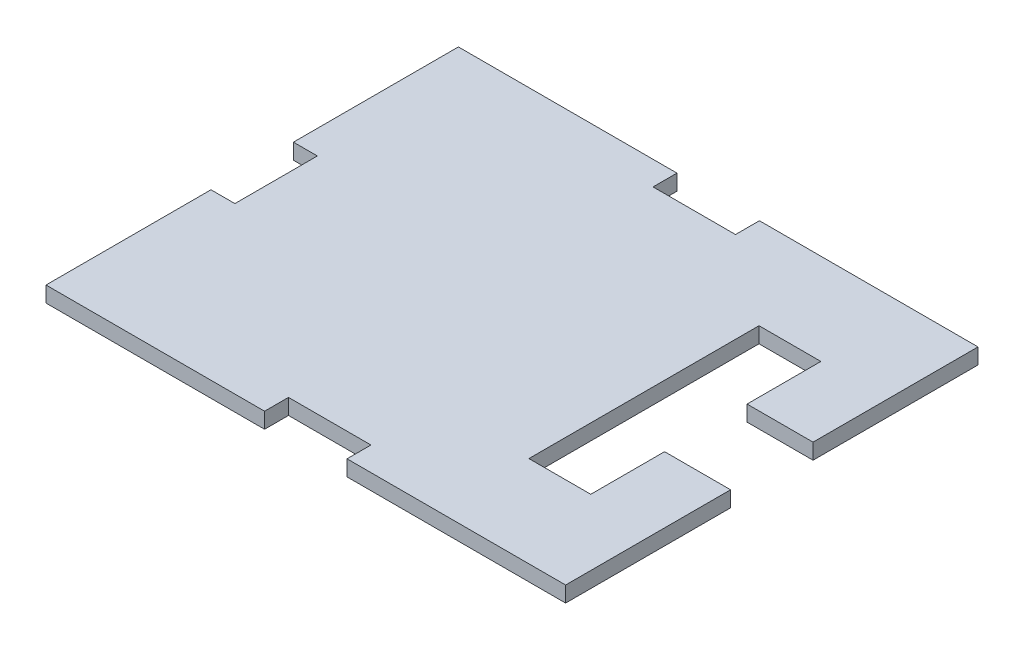
ISO-10303-21;
HEADER;
FILE_DESCRIPTION(('STEP AP214'),'2;1');
FILE_NAME('part.step','',(''),(''),'','','');
FILE_SCHEMA(('AUTOMOTIVE_DESIGN { 1 0 10303 214 1 1 1 1 }'));
ENDSEC;
DATA;
#1=APPLICATION_CONTEXT('core data for automotive mechanical design processes');
#2=APPLICATION_PROTOCOL_DEFINITION('international standard','automotive_design',2000,#1);
#3=PRODUCT_CONTEXT('',#1,'mechanical');
#4=PRODUCT('Part','Part','',(#3));
#5=PRODUCT_RELATED_PRODUCT_CATEGORY('part','',(#4));
#6=PRODUCT_DEFINITION_FORMATION('','',#4);
#7=PRODUCT_DEFINITION_CONTEXT('part definition',#1,'design');
#8=PRODUCT_DEFINITION('design','',#6,#7);
#9=PRODUCT_DEFINITION_SHAPE('','',#8);
#10=(LENGTH_UNIT() NAMED_UNIT(*) SI_UNIT(.MILLI.,.METRE.));
#11=(NAMED_UNIT(*) PLANE_ANGLE_UNIT() SI_UNIT($,.RADIAN.));
#12=(NAMED_UNIT(*) SI_UNIT($,.STERADIAN.) SOLID_ANGLE_UNIT());
#13=UNCERTAINTY_MEASURE_WITH_UNIT(LENGTH_MEASURE(1.E-05),#10,'distance_accuracy_value','');
#14=(GEOMETRIC_REPRESENTATION_CONTEXT(3) GLOBAL_UNCERTAINTY_ASSIGNED_CONTEXT((#13)) GLOBAL_UNIT_ASSIGNED_CONTEXT((#10,
#11,#12)) REPRESENTATION_CONTEXT('',''));
#15=CARTESIAN_POINT('',(0.,0.,0.));
#16=DIRECTION('',(0.,0.,1.));
#17=DIRECTION('',(1.,0.,0.));
#18=AXIS2_PLACEMENT_3D('',#15,#16,#17);
#19=CARTESIAN_POINT('',(80.01,4.826,12.7));
#20=DIRECTION('',(-1.,0.,0.));
#21=DIRECTION('',(0.,0.,1.));
#22=AXIS2_PLACEMENT_3D('',#19,#20,#21);
#23=PLANE('',#22);
#24=DIRECTION('',(0.,0.,-1.));
#25=VECTOR('',#24,1.);
#26=CARTESIAN_POINT('',(80.01,0.,12.7));
#27=LINE('',#26,#25);
#28=CARTESIAN_POINT('',(80.01,0.,63.5));
#29=VERTEX_POINT('',#28);
#30=CARTESIAN_POINT('',(80.01,0.,12.7));
#31=VERTEX_POINT('',#30);
#32=EDGE_CURVE('E204',#29,#31,#27,.T.);
#33=ORIENTED_EDGE('',*,*,#32,.T.);
#34=DIRECTION('',(0.,-1.,0.));
#35=VECTOR('',#34,1.);
#36=CARTESIAN_POINT('',(80.01,4.826,12.7));
#37=LINE('',#36,#35);
#38=CARTESIAN_POINT('',(80.01,4.826,12.7));
#39=VERTEX_POINT('',#38);
#40=EDGE_CURVE('E12',#39,#31,#37,.T.);
#41=ORIENTED_EDGE('',*,*,#40,.F.);
#42=DIRECTION('',(0.,0.,-1.));
#43=VECTOR('',#42,1.);
#44=CARTESIAN_POINT('',(80.01,4.826,12.7));
#45=LINE('',#44,#43);
#46=CARTESIAN_POINT('',(80.01,4.826,63.5));
#47=VERTEX_POINT('',#46);
#48=EDGE_CURVE('E243',#47,#39,#45,.T.);
#49=ORIENTED_EDGE('',*,*,#48,.F.);
#50=DIRECTION('',(0.,-1.,0.));
#51=VECTOR('',#50,1.);
#52=CARTESIAN_POINT('',(80.01,4.826,63.5));
#53=LINE('',#52,#51);
#54=EDGE_CURVE('E200',#47,#29,#53,.T.);
#55=ORIENTED_EDGE('',*,*,#54,.T.);
#56=EDGE_LOOP('',(#33,#41,#49,#55));
#57=FACE_BOUND('',#56,.T.);
#58=ADVANCED_FACE('F34',(#57),#23,.F.);
#59=CARTESIAN_POINT('',(80.01,4.826,12.7));
#60=DIRECTION('',(0.,0.,1.));
#61=DIRECTION('',(1.,0.,0.));
#62=AXIS2_PLACEMENT_3D('',#59,#60,#61);
#63=PLANE('',#62);
#64=DIRECTION('',(-1.,0.,0.));
#65=VECTOR('',#64,1.);
#66=CARTESIAN_POINT('',(80.01,0.,12.7));
#67=LINE('',#66,#65);
#68=CARTESIAN_POINT('',(59.69,0.,12.7));
#69=VERTEX_POINT('',#68);
#70=EDGE_CURVE('E207',#31,#69,#67,.T.);
#71=ORIENTED_EDGE('',*,*,#70,.T.);
#72=DIRECTION('',(0.,1.,0.));
#73=VECTOR('',#72,1.);
#74=CARTESIAN_POINT('',(59.69,0.,12.7));
#75=LINE('',#74,#73);
#76=CARTESIAN_POINT('',(59.69,4.826,12.7));
#77=VERTEX_POINT('',#76);
#78=EDGE_CURVE('E371',#69,#77,#75,.T.);
#79=ORIENTED_EDGE('',*,*,#78,.T.);
#80=DIRECTION('',(-1.,0.,0.));
#81=VECTOR('',#80,1.);
#82=CARTESIAN_POINT('',(80.01,4.826,12.7));
#83=LINE('',#82,#81);
#84=EDGE_CURVE('E128',#39,#77,#83,.T.);
#85=ORIENTED_EDGE('',*,*,#84,.F.);
#86=ORIENTED_EDGE('',*,*,#40,.T.);
#87=EDGE_LOOP('',(#71,#79,#85,#86));
#88=FACE_BOUND('',#87,.T.);
#89=ADVANCED_FACE('F431',(#88),#63,.F.);
#90=CARTESIAN_POINT('',(80.01,4.826,-12.7));
#91=DIRECTION('',(0.,0.,-1.));
#92=DIRECTION('',(-1.,0.,0.));
#93=AXIS2_PLACEMENT_3D('',#90,#91,#92);
#94=PLANE('',#93);
#95=DIRECTION('',(1.,0.,0.));
#96=VECTOR('',#95,1.);
#97=CARTESIAN_POINT('',(80.01,0.,-12.7));
#98=LINE('',#97,#96);
#99=CARTESIAN_POINT('',(59.69,0.,-12.7));
#100=VERTEX_POINT('',#99);
#101=CARTESIAN_POINT('',(80.01,0.,-12.7));
#102=VERTEX_POINT('',#101);
#103=EDGE_CURVE('E211',#100,#102,#98,.T.);
#104=ORIENTED_EDGE('',*,*,#103,.T.);
#105=DIRECTION('',(0.,-1.,0.));
#106=VECTOR('',#105,1.);
#107=CARTESIAN_POINT('',(80.01,4.826,-12.7));
#108=LINE('',#107,#106);
#109=CARTESIAN_POINT('',(80.01,4.826,-12.7));
#110=VERTEX_POINT('',#109);
#111=EDGE_CURVE('E41',#110,#102,#108,.T.);
#112=ORIENTED_EDGE('',*,*,#111,.F.);
#113=DIRECTION('',(1.,0.,0.));
#114=VECTOR('',#113,1.);
#115=CARTESIAN_POINT('',(80.01,4.826,-12.7));
#116=LINE('',#115,#114);
#117=CARTESIAN_POINT('',(59.69,4.826,-12.7));
#118=VERTEX_POINT('',#117);
#119=EDGE_CURVE('E349',#118,#110,#116,.T.);
#120=ORIENTED_EDGE('',*,*,#119,.F.);
#121=DIRECTION('',(0.,1.,0.));
#122=VECTOR('',#121,1.);
#123=CARTESIAN_POINT('',(59.69,0.,-12.7));
#124=LINE('',#123,#122);
#125=EDGE_CURVE('E361',#100,#118,#124,.T.);
#126=ORIENTED_EDGE('',*,*,#125,.F.);
#127=EDGE_LOOP('',(#104,#112,#120,#126));
#128=FACE_BOUND('',#127,.T.);
#129=ADVANCED_FACE('F360',(#128),#94,.F.);
#130=CARTESIAN_POINT('',(80.01,4.826,-63.5));
#131=DIRECTION('',(-1.,0.,0.));
#132=DIRECTION('',(0.,0.,1.));
#133=AXIS2_PLACEMENT_3D('',#130,#131,#132);
#134=PLANE('',#133);
#135=DIRECTION('',(0.,0.,-1.));
#136=VECTOR('',#135,1.);
#137=CARTESIAN_POINT('',(80.01,0.,-63.5));
#138=LINE('',#137,#136);
#139=CARTESIAN_POINT('',(80.01,0.,-63.5));
#140=VERTEX_POINT('',#139);
#141=EDGE_CURVE('E213',#102,#140,#138,.T.);
#142=ORIENTED_EDGE('',*,*,#141,.T.);
#143=DIRECTION('',(0.,-1.,0.));
#144=VECTOR('',#143,1.);
#145=CARTESIAN_POINT('',(80.01,4.826,-63.5));
#146=LINE('',#145,#144);
#147=CARTESIAN_POINT('',(80.01,4.826,-63.5));
#148=VERTEX_POINT('',#147);
#149=EDGE_CURVE('E280',#148,#140,#146,.T.);
#150=ORIENTED_EDGE('',*,*,#149,.F.);
#151=DIRECTION('',(0.,0.,-1.));
#152=VECTOR('',#151,1.);
#153=CARTESIAN_POINT('',(80.01,4.826,-63.5));
#154=LINE('',#153,#152);
#155=EDGE_CURVE('E289',#110,#148,#154,.T.);
#156=ORIENTED_EDGE('',*,*,#155,.F.);
#157=ORIENTED_EDGE('',*,*,#111,.T.);
#158=EDGE_LOOP('',(#142,#150,#156,#157));
#159=FACE_BOUND('',#158,.T.);
#160=ADVANCED_FACE('F287',(#159),#134,.F.);
#161=CARTESIAN_POINT('',(12.7,4.826,-63.5));
#162=DIRECTION('',(0.,0.,1.));
#163=DIRECTION('',(1.,0.,0.));
#164=AXIS2_PLACEMENT_3D('',#161,#162,#163);
#165=PLANE('',#164);
#166=DIRECTION('',(-1.,0.,0.));
#167=VECTOR('',#166,1.);
#168=CARTESIAN_POINT('',(12.7,0.,-63.5));
#169=LINE('',#168,#167);
#170=CARTESIAN_POINT('',(12.7,0.,-63.5));
#171=VERTEX_POINT('',#170);
#172=EDGE_CURVE('E215',#140,#171,#169,.T.);
#173=ORIENTED_EDGE('',*,*,#172,.T.);
#174=DIRECTION('',(0.,-1.,0.));
#175=VECTOR('',#174,1.);
#176=CARTESIAN_POINT('',(12.7,4.826,-63.5));
#177=LINE('',#176,#175);
#178=CARTESIAN_POINT('',(12.7,4.826,-63.5));
#179=VERTEX_POINT('',#178);
#180=EDGE_CURVE('E277',#179,#171,#177,.T.);
#181=ORIENTED_EDGE('',*,*,#180,.F.);
#182=DIRECTION('',(-1.,0.,0.));
#183=VECTOR('',#182,1.);
#184=CARTESIAN_POINT('',(12.7,4.826,-63.5));
#185=LINE('',#184,#183);
#186=EDGE_CURVE('E312',#148,#179,#185,.T.);
#187=ORIENTED_EDGE('',*,*,#186,.F.);
#188=ORIENTED_EDGE('',*,*,#149,.T.);
#189=EDGE_LOOP('',(#173,#181,#187,#188));
#190=FACE_BOUND('',#189,.T.);
#191=ADVANCED_FACE('F303',(#190),#165,.F.);
#192=CARTESIAN_POINT('',(12.7,4.826,-63.5));
#193=DIRECTION('',(1.,0.,0.));
#194=DIRECTION('',(0.,0.,-1.));
#195=AXIS2_PLACEMENT_3D('',#192,#193,#194);
#196=PLANE('',#195);
#197=DIRECTION('',(0.,0.,1.));
#198=VECTOR('',#197,1.);
#199=CARTESIAN_POINT('',(12.7,0.,-63.5));
#200=LINE('',#199,#198);
#201=CARTESIAN_POINT('',(12.7,0.,-56.134));
#202=VERTEX_POINT('',#201);
#203=EDGE_CURVE('E217',#171,#202,#200,.T.);
#204=ORIENTED_EDGE('',*,*,#203,.T.);
#205=DIRECTION('',(0.,-1.,0.));
#206=VECTOR('',#205,1.);
#207=CARTESIAN_POINT('',(12.7,4.826,-56.134));
#208=LINE('',#207,#206);
#209=CARTESIAN_POINT('',(12.7,4.826,-56.134));
#210=VERTEX_POINT('',#209);
#211=EDGE_CURVE('E274',#210,#202,#208,.T.);
#212=ORIENTED_EDGE('',*,*,#211,.F.);
#213=DIRECTION('',(0.,0.,1.));
#214=VECTOR('',#213,1.);
#215=CARTESIAN_POINT('',(12.7,4.826,-63.5));
#216=LINE('',#215,#214);
#217=EDGE_CURVE('E309',#179,#210,#216,.T.);
#218=ORIENTED_EDGE('',*,*,#217,.F.);
#219=ORIENTED_EDGE('',*,*,#180,.T.);
#220=EDGE_LOOP('',(#204,#212,#218,#219));
#221=FACE_BOUND('',#220,.T.);
#222=ADVANCED_FACE('F307',(#221),#196,.F.);
#223=CARTESIAN_POINT('',(-12.7,4.826,-56.134));
#224=DIRECTION('',(0.,0.,1.));
#225=DIRECTION('',(1.,0.,0.));
#226=AXIS2_PLACEMENT_3D('',#223,#224,#225);
#227=PLANE('',#226);
#228=DIRECTION('',(-1.,0.,0.));
#229=VECTOR('',#228,1.);
#230=CARTESIAN_POINT('',(-12.7,0.,-56.134));
#231=LINE('',#230,#229);
#232=CARTESIAN_POINT('',(-12.7,0.,-56.134));
#233=VERTEX_POINT('',#232);
#234=EDGE_CURVE('E219',#202,#233,#231,.T.);
#235=ORIENTED_EDGE('',*,*,#234,.T.);
#236=DIRECTION('',(0.,-1.,0.));
#237=VECTOR('',#236,1.);
#238=CARTESIAN_POINT('',(-12.7,4.826,-56.134));
#239=LINE('',#238,#237);
#240=CARTESIAN_POINT('',(-12.7,4.826,-56.134));
#241=VERTEX_POINT('',#240);
#242=EDGE_CURVE('E271',#241,#233,#239,.T.);
#243=ORIENTED_EDGE('',*,*,#242,.F.);
#244=DIRECTION('',(-1.,0.,0.));
#245=VECTOR('',#244,1.);
#246=CARTESIAN_POINT('',(-12.7,4.826,-56.134));
#247=LINE('',#246,#245);
#248=EDGE_CURVE('E311',#210,#241,#247,.T.);
#249=ORIENTED_EDGE('',*,*,#248,.F.);
#250=ORIENTED_EDGE('',*,*,#211,.T.);
#251=EDGE_LOOP('',(#235,#243,#249,#250));
#252=FACE_BOUND('',#251,.T.);
#253=ADVANCED_FACE('F445',(#252),#227,.F.);
#254=CARTESIAN_POINT('',(-12.7,4.826,-63.5));
#255=DIRECTION('',(-1.,0.,0.));
#256=DIRECTION('',(0.,0.,1.));
#257=AXIS2_PLACEMENT_3D('',#254,#255,#256);
#258=PLANE('',#257);
#259=DIRECTION('',(0.,0.,-1.));
#260=VECTOR('',#259,1.);
#261=CARTESIAN_POINT('',(-12.7,0.,-63.5));
#262=LINE('',#261,#260);
#263=CARTESIAN_POINT('',(-12.7,0.,-63.5));
#264=VERTEX_POINT('',#263);
#265=EDGE_CURVE('E221',#233,#264,#262,.T.);
#266=ORIENTED_EDGE('',*,*,#265,.T.);
#267=DIRECTION('',(0.,-1.,0.));
#268=VECTOR('',#267,1.);
#269=CARTESIAN_POINT('',(-12.7,4.826,-63.5));
#270=LINE('',#269,#268);
#271=CARTESIAN_POINT('',(-12.7,4.826,-63.5));
#272=VERTEX_POINT('',#271);
#273=EDGE_CURVE('E268',#272,#264,#270,.T.);
#274=ORIENTED_EDGE('',*,*,#273,.F.);
#275=DIRECTION('',(0.,0.,-1.));
#276=VECTOR('',#275,1.);
#277=CARTESIAN_POINT('',(-12.7,4.826,-63.5));
#278=LINE('',#277,#276);
#279=EDGE_CURVE('E314',#241,#272,#278,.T.);
#280=ORIENTED_EDGE('',*,*,#279,.F.);
#281=ORIENTED_EDGE('',*,*,#242,.T.);
#282=EDGE_LOOP('',(#266,#274,#280,#281));
#283=FACE_BOUND('',#282,.T.);
#284=ADVANCED_FACE('F448',(#283),#258,.F.);
#285=CARTESIAN_POINT('',(-80.01,4.826,-63.5));
#286=DIRECTION('',(0.,0.,1.));
#287=DIRECTION('',(1.,0.,0.));
#288=AXIS2_PLACEMENT_3D('',#285,#286,#287);
#289=PLANE('',#288);
#290=DIRECTION('',(-1.,0.,0.));
#291=VECTOR('',#290,1.);
#292=CARTESIAN_POINT('',(-80.01,0.,-63.5));
#293=LINE('',#292,#291);
#294=CARTESIAN_POINT('',(-80.01,0.,-63.5));
#295=VERTEX_POINT('',#294);
#296=EDGE_CURVE('E223',#264,#295,#293,.T.);
#297=ORIENTED_EDGE('',*,*,#296,.T.);
#298=DIRECTION('',(0.,-1.,0.));
#299=VECTOR('',#298,1.);
#300=CARTESIAN_POINT('',(-80.01,4.826,-63.5));
#301=LINE('',#300,#299);
#302=CARTESIAN_POINT('',(-80.01,4.826,-63.5));
#303=VERTEX_POINT('',#302);
#304=EDGE_CURVE('E265',#303,#295,#301,.T.);
#305=ORIENTED_EDGE('',*,*,#304,.F.);
#306=DIRECTION('',(-1.,0.,0.));
#307=VECTOR('',#306,1.);
#308=CARTESIAN_POINT('',(-80.01,4.826,-63.5));
#309=LINE('',#308,#307);
#310=EDGE_CURVE('E320',#272,#303,#309,.T.);
#311=ORIENTED_EDGE('',*,*,#310,.F.);
#312=ORIENTED_EDGE('',*,*,#273,.T.);
#313=EDGE_LOOP('',(#297,#305,#311,#312));
#314=FACE_BOUND('',#313,.T.);
#315=ADVANCED_FACE('F452',(#314),#289,.F.);
#316=CARTESIAN_POINT('',(-80.01,4.826,-63.5));
#317=DIRECTION('',(1.,0.,0.));
#318=DIRECTION('',(0.,0.,-1.));
#319=AXIS2_PLACEMENT_3D('',#316,#317,#318);
#320=PLANE('',#319);
#321=DIRECTION('',(0.,0.,1.));
#322=VECTOR('',#321,1.);
#323=CARTESIAN_POINT('',(-80.01,0.,-63.5));
#324=LINE('',#323,#322);
#325=CARTESIAN_POINT('',(-80.01,0.,-12.7));
#326=VERTEX_POINT('',#325);
#327=EDGE_CURVE('E225',#295,#326,#324,.T.);
#328=ORIENTED_EDGE('',*,*,#327,.T.);
#329=DIRECTION('',(0.,-1.,0.));
#330=VECTOR('',#329,1.);
#331=CARTESIAN_POINT('',(-80.01,4.826,-12.7));
#332=LINE('',#331,#330);
#333=CARTESIAN_POINT('',(-80.01,4.826,-12.7));
#334=VERTEX_POINT('',#333);
#335=EDGE_CURVE('E262',#334,#326,#332,.T.);
#336=ORIENTED_EDGE('',*,*,#335,.F.);
#337=DIRECTION('',(0.,0.,1.));
#338=VECTOR('',#337,1.);
#339=CARTESIAN_POINT('',(-80.01,4.826,-63.5));
#340=LINE('',#339,#338);
#341=EDGE_CURVE('E322',#303,#334,#340,.T.);
#342=ORIENTED_EDGE('',*,*,#341,.F.);
#343=ORIENTED_EDGE('',*,*,#304,.T.);
#344=EDGE_LOOP('',(#328,#336,#342,#343));
#345=FACE_BOUND('',#344,.T.);
#346=ADVANCED_FACE('F456',(#345),#320,.F.);
#347=CARTESIAN_POINT('',(-80.01,4.826,-12.7));
#348=DIRECTION('',(0.,0.,-1.));
#349=DIRECTION('',(-1.,0.,0.));
#350=AXIS2_PLACEMENT_3D('',#347,#348,#349);
#351=PLANE('',#350);
#352=DIRECTION('',(1.,0.,0.));
#353=VECTOR('',#352,1.);
#354=CARTESIAN_POINT('',(-80.01,0.,-12.7));
#355=LINE('',#354,#353);
#356=CARTESIAN_POINT('',(-72.644,0.,-12.7));
#357=VERTEX_POINT('',#356);
#358=EDGE_CURVE('E227',#326,#357,#355,.T.);
#359=ORIENTED_EDGE('',*,*,#358,.T.);
#360=DIRECTION('',(0.,-1.,0.));
#361=VECTOR('',#360,1.);
#362=CARTESIAN_POINT('',(-72.644,4.826,-12.7));
#363=LINE('',#362,#361);
#364=CARTESIAN_POINT('',(-72.644,4.826,-12.7));
#365=VERTEX_POINT('',#364);
#366=EDGE_CURVE('E259',#365,#357,#363,.T.);
#367=ORIENTED_EDGE('',*,*,#366,.F.);
#368=DIRECTION('',(1.,0.,0.));
#369=VECTOR('',#368,1.);
#370=CARTESIAN_POINT('',(-80.01,4.826,-12.7));
#371=LINE('',#370,#369);
#372=EDGE_CURVE('E324',#334,#365,#371,.T.);
#373=ORIENTED_EDGE('',*,*,#372,.F.);
#374=ORIENTED_EDGE('',*,*,#335,.T.);
#375=EDGE_LOOP('',(#359,#367,#373,#374));
#376=FACE_BOUND('',#375,.T.);
#377=ADVANCED_FACE('F460',(#376),#351,.F.);
#378=CARTESIAN_POINT('',(-72.644,4.826,12.7));
#379=DIRECTION('',(1.,0.,0.));
#380=DIRECTION('',(0.,0.,-1.));
#381=AXIS2_PLACEMENT_3D('',#378,#379,#380);
#382=PLANE('',#381);
#383=DIRECTION('',(0.,0.,1.));
#384=VECTOR('',#383,1.);
#385=CARTESIAN_POINT('',(-72.644,0.,12.7));
#386=LINE('',#385,#384);
#387=CARTESIAN_POINT('',(-72.644,0.,12.7));
#388=VERTEX_POINT('',#387);
#389=EDGE_CURVE('E229',#357,#388,#386,.T.);
#390=ORIENTED_EDGE('',*,*,#389,.T.);
#391=DIRECTION('',(0.,-1.,0.));
#392=VECTOR('',#391,1.);
#393=CARTESIAN_POINT('',(-72.644,4.826,12.7));
#394=LINE('',#393,#392);
#395=CARTESIAN_POINT('',(-72.644,4.826,12.7));
#396=VERTEX_POINT('',#395);
#397=EDGE_CURVE('E256',#396,#388,#394,.T.);
#398=ORIENTED_EDGE('',*,*,#397,.F.);
#399=DIRECTION('',(0.,0.,1.));
#400=VECTOR('',#399,1.);
#401=CARTESIAN_POINT('',(-72.644,4.826,12.7));
#402=LINE('',#401,#400);
#403=EDGE_CURVE('E326',#365,#396,#402,.T.);
#404=ORIENTED_EDGE('',*,*,#403,.F.);
#405=ORIENTED_EDGE('',*,*,#366,.T.);
#406=EDGE_LOOP('',(#390,#398,#404,#405));
#407=FACE_BOUND('',#406,.T.);
#408=ADVANCED_FACE('F464',(#407),#382,.F.);
#409=CARTESIAN_POINT('',(-80.01,4.826,12.7));
#410=DIRECTION('',(0.,0.,1.));
#411=DIRECTION('',(1.,0.,0.));
#412=AXIS2_PLACEMENT_3D('',#409,#410,#411);
#413=PLANE('',#412);
#414=DIRECTION('',(-1.,0.,0.));
#415=VECTOR('',#414,1.);
#416=CARTESIAN_POINT('',(-80.01,0.,12.7));
#417=LINE('',#416,#415);
#418=CARTESIAN_POINT('',(-80.01,0.,12.7));
#419=VERTEX_POINT('',#418);
#420=EDGE_CURVE('E231',#388,#419,#417,.T.);
#421=ORIENTED_EDGE('',*,*,#420,.T.);
#422=DIRECTION('',(0.,-1.,0.));
#423=VECTOR('',#422,1.);
#424=CARTESIAN_POINT('',(-80.01,4.826,12.7));
#425=LINE('',#424,#423);
#426=CARTESIAN_POINT('',(-80.01,4.826,12.7));
#427=VERTEX_POINT('',#426);
#428=EDGE_CURVE('E253',#427,#419,#425,.T.);
#429=ORIENTED_EDGE('',*,*,#428,.F.);
#430=DIRECTION('',(-1.,0.,0.));
#431=VECTOR('',#430,1.);
#432=CARTESIAN_POINT('',(-80.01,4.826,12.7));
#433=LINE('',#432,#431);
#434=EDGE_CURVE('E328',#396,#427,#433,.T.);
#435=ORIENTED_EDGE('',*,*,#434,.F.);
#436=ORIENTED_EDGE('',*,*,#397,.T.);
#437=EDGE_LOOP('',(#421,#429,#435,#436));
#438=FACE_BOUND('',#437,.T.);
#439=ADVANCED_FACE('F468',(#438),#413,.F.);
#440=CARTESIAN_POINT('',(-80.01,4.826,12.7));
#441=DIRECTION('',(1.,0.,0.));
#442=DIRECTION('',(0.,0.,-1.));
#443=AXIS2_PLACEMENT_3D('',#440,#441,#442);
#444=PLANE('',#443);
#445=DIRECTION('',(0.,0.,1.));
#446=VECTOR('',#445,1.);
#447=CARTESIAN_POINT('',(-80.01,0.,12.7));
#448=LINE('',#447,#446);
#449=CARTESIAN_POINT('',(-80.01,0.,63.5));
#450=VERTEX_POINT('',#449);
#451=EDGE_CURVE('E233',#419,#450,#448,.T.);
#452=ORIENTED_EDGE('',*,*,#451,.T.);
#453=DIRECTION('',(0.,-1.,0.));
#454=VECTOR('',#453,1.);
#455=CARTESIAN_POINT('',(-80.01,4.826,63.5));
#456=LINE('',#455,#454);
#457=CARTESIAN_POINT('',(-80.01,4.826,63.5));
#458=VERTEX_POINT('',#457);
#459=EDGE_CURVE('E250',#458,#450,#456,.T.);
#460=ORIENTED_EDGE('',*,*,#459,.F.);
#461=DIRECTION('',(0.,0.,1.));
#462=VECTOR('',#461,1.);
#463=CARTESIAN_POINT('',(-80.01,4.826,12.7));
#464=LINE('',#463,#462);
#465=EDGE_CURVE('E330',#427,#458,#464,.T.);
#466=ORIENTED_EDGE('',*,*,#465,.F.);
#467=ORIENTED_EDGE('',*,*,#428,.T.);
#468=EDGE_LOOP('',(#452,#460,#466,#467));
#469=FACE_BOUND('',#468,.T.);
#470=ADVANCED_FACE('F472',(#469),#444,.F.);
#471=CARTESIAN_POINT('',(-80.01,4.826,63.5));
#472=DIRECTION('',(0.,0.,-1.));
#473=DIRECTION('',(-1.,0.,0.));
#474=AXIS2_PLACEMENT_3D('',#471,#472,#473);
#475=PLANE('',#474);
#476=DIRECTION('',(1.,0.,0.));
#477=VECTOR('',#476,1.);
#478=CARTESIAN_POINT('',(-80.01,0.,63.5));
#479=LINE('',#478,#477);
#480=CARTESIAN_POINT('',(-12.7,0.,63.5));
#481=VERTEX_POINT('',#480);
#482=EDGE_CURVE('E234',#450,#481,#479,.T.);
#483=ORIENTED_EDGE('',*,*,#482,.T.);
#484=DIRECTION('',(0.,-1.,0.));
#485=VECTOR('',#484,1.);
#486=CARTESIAN_POINT('',(-12.7,4.826,63.5));
#487=LINE('',#486,#485);
#488=CARTESIAN_POINT('',(-12.7,4.826,63.5));
#489=VERTEX_POINT('',#488);
#490=EDGE_CURVE('E247',#489,#481,#487,.T.);
#491=ORIENTED_EDGE('',*,*,#490,.F.);
#492=DIRECTION('',(1.,0.,0.));
#493=VECTOR('',#492,1.);
#494=CARTESIAN_POINT('',(-80.01,4.826,63.5));
#495=LINE('',#494,#493);
#496=EDGE_CURVE('E332',#458,#489,#495,.T.);
#497=ORIENTED_EDGE('',*,*,#496,.F.);
#498=ORIENTED_EDGE('',*,*,#459,.T.);
#499=EDGE_LOOP('',(#483,#491,#497,#498));
#500=FACE_BOUND('',#499,.T.);
#501=ADVANCED_FACE('F338',(#500),#475,.F.);
#502=CARTESIAN_POINT('',(-12.7,4.826,63.5));
#503=DIRECTION('',(-1.,0.,0.));
#504=DIRECTION('',(0.,0.,1.));
#505=AXIS2_PLACEMENT_3D('',#502,#503,#504);
#506=PLANE('',#505);
#507=DIRECTION('',(0.,0.,-1.));
#508=VECTOR('',#507,1.);
#509=CARTESIAN_POINT('',(-12.7,0.,63.5));
#510=LINE('',#509,#508);
#511=CARTESIAN_POINT('',(-12.7,0.,56.134));
#512=VERTEX_POINT('',#511);
#513=EDGE_CURVE('E237',#481,#512,#510,.T.);
#514=ORIENTED_EDGE('',*,*,#513,.T.);
#515=DIRECTION('',(0.,-1.,0.));
#516=VECTOR('',#515,1.);
#517=CARTESIAN_POINT('',(-12.7,4.826,56.134));
#518=LINE('',#517,#516);
#519=CARTESIAN_POINT('',(-12.7,4.826,56.134));
#520=VERTEX_POINT('',#519);
#521=EDGE_CURVE('E195',#520,#512,#518,.T.);
#522=ORIENTED_EDGE('',*,*,#521,.F.);
#523=DIRECTION('',(0.,0.,-1.));
#524=VECTOR('',#523,1.);
#525=CARTESIAN_POINT('',(-12.7,4.826,63.5));
#526=LINE('',#525,#524);
#527=EDGE_CURVE('E183',#489,#520,#526,.T.);
#528=ORIENTED_EDGE('',*,*,#527,.F.);
#529=ORIENTED_EDGE('',*,*,#490,.T.);
#530=EDGE_LOOP('',(#514,#522,#528,#529));
#531=FACE_BOUND('',#530,.T.);
#532=ADVANCED_FACE('F342',(#531),#506,.F.);
#533=CARTESIAN_POINT('',(-12.7,4.826,56.134));
#534=DIRECTION('',(0.,0.,-1.));
#535=DIRECTION('',(-1.,0.,0.));
#536=AXIS2_PLACEMENT_3D('',#533,#534,#535);
#537=PLANE('',#536);
#538=DIRECTION('',(1.,0.,0.));
#539=VECTOR('',#538,1.);
#540=CARTESIAN_POINT('',(-12.7,0.,56.134));
#541=LINE('',#540,#539);
#542=CARTESIAN_POINT('',(12.7,0.,56.134));
#543=VERTEX_POINT('',#542);
#544=EDGE_CURVE('E192',#512,#543,#541,.T.);
#545=ORIENTED_EDGE('',*,*,#544,.T.);
#546=DIRECTION('',(0.,-1.,0.));
#547=VECTOR('',#546,1.);
#548=CARTESIAN_POINT('',(12.7,4.826,56.134));
#549=LINE('',#548,#547);
#550=CARTESIAN_POINT('',(12.7,4.826,56.134));
#551=VERTEX_POINT('',#550);
#552=EDGE_CURVE('E189',#551,#543,#549,.T.);
#553=ORIENTED_EDGE('',*,*,#552,.F.);
#554=DIRECTION('',(1.,0.,0.));
#555=VECTOR('',#554,1.);
#556=CARTESIAN_POINT('',(-12.7,4.826,56.134));
#557=LINE('',#556,#555);
#558=EDGE_CURVE('E175',#520,#551,#557,.T.);
#559=ORIENTED_EDGE('',*,*,#558,.F.);
#560=ORIENTED_EDGE('',*,*,#521,.T.);
#561=EDGE_LOOP('',(#545,#553,#559,#560));
#562=FACE_BOUND('',#561,.T.);
#563=ADVANCED_FACE('F190',(#562),#537,.F.);
#564=CARTESIAN_POINT('',(12.7,4.826,63.5));
#565=DIRECTION('',(1.,0.,0.));
#566=DIRECTION('',(0.,0.,-1.));
#567=AXIS2_PLACEMENT_3D('',#564,#565,#566);
#568=PLANE('',#567);
#569=DIRECTION('',(0.,0.,1.));
#570=VECTOR('',#569,1.);
#571=CARTESIAN_POINT('',(12.7,0.,63.5));
#572=LINE('',#571,#570);
#573=CARTESIAN_POINT('',(12.7,0.,63.5));
#574=VERTEX_POINT('',#573);
#575=EDGE_CURVE('E240',#543,#574,#572,.T.);
#576=ORIENTED_EDGE('',*,*,#575,.T.);
#577=DIRECTION('',(0.,-1.,0.));
#578=VECTOR('',#577,1.);
#579=CARTESIAN_POINT('',(12.7,4.826,63.5));
#580=LINE('',#579,#578);
#581=CARTESIAN_POINT('',(12.7,4.826,63.5));
#582=VERTEX_POINT('',#581);
#583=EDGE_CURVE('E196',#582,#574,#580,.T.);
#584=ORIENTED_EDGE('',*,*,#583,.F.);
#585=DIRECTION('',(0.,0.,1.));
#586=VECTOR('',#585,1.);
#587=CARTESIAN_POINT('',(12.7,4.826,63.5));
#588=LINE('',#587,#586);
#589=EDGE_CURVE('E180',#551,#582,#588,.T.);
#590=ORIENTED_EDGE('',*,*,#589,.F.);
#591=ORIENTED_EDGE('',*,*,#552,.T.);
#592=EDGE_LOOP('',(#576,#584,#590,#591));
#593=FACE_BOUND('',#592,.T.);
#594=ADVANCED_FACE('F198',(#593),#568,.F.);
#595=CARTESIAN_POINT('',(12.7,4.826,63.5));
#596=DIRECTION('',(0.,0.,-1.));
#597=DIRECTION('',(-1.,0.,0.));
#598=AXIS2_PLACEMENT_3D('',#595,#596,#597);
#599=PLANE('',#598);
#600=DIRECTION('',(1.,0.,0.));
#601=VECTOR('',#600,1.);
#602=CARTESIAN_POINT('',(12.7,0.,63.5));
#603=LINE('',#602,#601);
#604=EDGE_CURVE('E120',#574,#29,#603,.T.);
#605=ORIENTED_EDGE('',*,*,#604,.T.);
#606=ORIENTED_EDGE('',*,*,#54,.F.);
#607=DIRECTION('',(1.,0.,0.));
#608=VECTOR('',#607,1.);
#609=CARTESIAN_POINT('',(12.7,4.826,63.5));
#610=LINE('',#609,#608);
#611=EDGE_CURVE('E57',#582,#47,#610,.T.);
#612=ORIENTED_EDGE('',*,*,#611,.F.);
#613=ORIENTED_EDGE('',*,*,#583,.T.);
#614=EDGE_LOOP('',(#605,#606,#612,#613));
#615=FACE_BOUND('',#614,.T.);
#616=ADVANCED_FACE('F344',(#615),#599,.F.);
#617=CARTESIAN_POINT('',(0.,4.826,0.));
#618=DIRECTION('',(0.,1.,0.));
#619=DIRECTION('',(0.,0.,1.));
#620=AXIS2_PLACEMENT_3D('',#617,#618,#619);
#621=PLANE('',#620);
#622=DIRECTION('',(0.,0.,-1.));
#623=VECTOR('',#622,1.);
#624=CARTESIAN_POINT('',(59.69,4.826,-12.7));
#625=LINE('',#624,#623);
#626=CARTESIAN_POINT('',(59.69,4.826,-35.433));
#627=VERTEX_POINT('',#626);
#628=EDGE_CURVE('E358',#118,#627,#625,.T.);
#629=ORIENTED_EDGE('',*,*,#628,.F.);
#630=ORIENTED_EDGE('',*,*,#119,.T.);
#631=ORIENTED_EDGE('',*,*,#155,.T.);
#632=ORIENTED_EDGE('',*,*,#186,.T.);
#633=ORIENTED_EDGE('',*,*,#217,.T.);
#634=ORIENTED_EDGE('',*,*,#248,.T.);
#635=ORIENTED_EDGE('',*,*,#279,.T.);
#636=ORIENTED_EDGE('',*,*,#310,.T.);
#637=ORIENTED_EDGE('',*,*,#341,.T.);
#638=ORIENTED_EDGE('',*,*,#372,.T.);
#639=ORIENTED_EDGE('',*,*,#403,.T.);
#640=ORIENTED_EDGE('',*,*,#434,.T.);
#641=ORIENTED_EDGE('',*,*,#465,.T.);
#642=ORIENTED_EDGE('',*,*,#496,.T.);
#643=ORIENTED_EDGE('',*,*,#527,.T.);
#644=ORIENTED_EDGE('',*,*,#558,.T.);
#645=ORIENTED_EDGE('',*,*,#589,.T.);
#646=ORIENTED_EDGE('',*,*,#611,.T.);
#647=ORIENTED_EDGE('',*,*,#48,.T.);
#648=ORIENTED_EDGE('',*,*,#84,.T.);
#649=DIRECTION('',(0.,0.,-1.));
#650=VECTOR('',#649,1.);
#651=CARTESIAN_POINT('',(59.69,4.826,35.433));
#652=LINE('',#651,#650);
#653=CARTESIAN_POINT('',(59.69,4.826,35.433));
#654=VERTEX_POINT('',#653);
#655=EDGE_CURVE('E399',#654,#77,#652,.T.);
#656=ORIENTED_EDGE('',*,*,#655,.F.);
#657=DIRECTION('',(1.,0.,0.));
#658=VECTOR('',#657,1.);
#659=CARTESIAN_POINT('',(59.69,4.826,35.433));
#660=LINE('',#659,#658);
#661=CARTESIAN_POINT('',(40.64,4.826,35.433));
#662=VERTEX_POINT('',#661);
#663=EDGE_CURVE('E397',#662,#654,#660,.T.);
#664=ORIENTED_EDGE('',*,*,#663,.F.);
#665=DIRECTION('',(0.,0.,1.));
#666=VECTOR('',#665,1.);
#667=CARTESIAN_POINT('',(40.64,4.826,35.433));
#668=LINE('',#667,#666);
#669=CARTESIAN_POINT('',(40.64,4.826,-35.433));
#670=VERTEX_POINT('',#669);
#671=EDGE_CURVE('E395',#670,#662,#668,.T.);
#672=ORIENTED_EDGE('',*,*,#671,.F.);
#673=DIRECTION('',(-1.,0.,0.));
#674=VECTOR('',#673,1.);
#675=CARTESIAN_POINT('',(59.69,4.826,-35.433));
#676=LINE('',#675,#674);
#677=EDGE_CURVE('E402',#627,#670,#676,.T.);
#678=ORIENTED_EDGE('',*,*,#677,.F.);
#679=EDGE_LOOP('',(#629,#630,#631,#632,#633,#634,#635,#636,#637,#638,#639,#640,#641,#642,#643,
#644,#645,#646,#647,#648,#656,#664,#672,#678));
#680=FACE_BOUND('',#679,.T.);
#681=ADVANCED_FACE('F178',(#680),#621,.T.);
#682=CARTESIAN_POINT('',(0.,0.,0.));
#683=DIRECTION('',(0.,1.,0.));
#684=DIRECTION('',(0.,0.,1.));
#685=AXIS2_PLACEMENT_3D('',#682,#683,#684);
#686=PLANE('',#685);
#687=ORIENTED_EDGE('',*,*,#103,.F.);
#688=DIRECTION('',(0.,0.,-1.));
#689=VECTOR('',#688,1.);
#690=CARTESIAN_POINT('',(59.69,0.,-12.7));
#691=LINE('',#690,#689);
#692=CARTESIAN_POINT('',(59.69,0.,-35.433));
#693=VERTEX_POINT('',#692);
#694=EDGE_CURVE('E369',#100,#693,#691,.T.);
#695=ORIENTED_EDGE('',*,*,#694,.T.);
#696=DIRECTION('',(-1.,0.,0.));
#697=VECTOR('',#696,1.);
#698=CARTESIAN_POINT('',(59.69,0.,-35.433));
#699=LINE('',#698,#697);
#700=CARTESIAN_POINT('',(40.64,0.,-35.433));
#701=VERTEX_POINT('',#700);
#702=EDGE_CURVE('E382',#693,#701,#699,.T.);
#703=ORIENTED_EDGE('',*,*,#702,.T.);
#704=DIRECTION('',(0.,0.,1.));
#705=VECTOR('',#704,1.);
#706=CARTESIAN_POINT('',(40.64,0.,35.433));
#707=LINE('',#706,#705);
#708=CARTESIAN_POINT('',(40.64,0.,35.433));
#709=VERTEX_POINT('',#708);
#710=EDGE_CURVE('E404',#701,#709,#707,.T.);
#711=ORIENTED_EDGE('',*,*,#710,.T.);
#712=DIRECTION('',(1.,0.,0.));
#713=VECTOR('',#712,1.);
#714=CARTESIAN_POINT('',(59.69,0.,35.433));
#715=LINE('',#714,#713);
#716=CARTESIAN_POINT('',(59.69,0.,35.433));
#717=VERTEX_POINT('',#716);
#718=EDGE_CURVE('E428',#709,#717,#715,.T.);
#719=ORIENTED_EDGE('',*,*,#718,.T.);
#720=DIRECTION('',(0.,0.,-1.));
#721=VECTOR('',#720,1.);
#722=CARTESIAN_POINT('',(59.69,0.,35.433));
#723=LINE('',#722,#721);
#724=EDGE_CURVE('E48',#717,#69,#723,.T.);
#725=ORIENTED_EDGE('',*,*,#724,.T.);
#726=ORIENTED_EDGE('',*,*,#70,.F.);
#727=ORIENTED_EDGE('',*,*,#32,.F.);
#728=ORIENTED_EDGE('',*,*,#604,.F.);
#729=ORIENTED_EDGE('',*,*,#575,.F.);
#730=ORIENTED_EDGE('',*,*,#544,.F.);
#731=ORIENTED_EDGE('',*,*,#513,.F.);
#732=ORIENTED_EDGE('',*,*,#482,.F.);
#733=ORIENTED_EDGE('',*,*,#451,.F.);
#734=ORIENTED_EDGE('',*,*,#420,.F.);
#735=ORIENTED_EDGE('',*,*,#389,.F.);
#736=ORIENTED_EDGE('',*,*,#358,.F.);
#737=ORIENTED_EDGE('',*,*,#327,.F.);
#738=ORIENTED_EDGE('',*,*,#296,.F.);
#739=ORIENTED_EDGE('',*,*,#265,.F.);
#740=ORIENTED_EDGE('',*,*,#234,.F.);
#741=ORIENTED_EDGE('',*,*,#203,.F.);
#742=ORIENTED_EDGE('',*,*,#172,.F.);
#743=ORIENTED_EDGE('',*,*,#141,.F.);
#744=EDGE_LOOP('',(#687,#695,#703,#711,#719,#725,#726,#727,#728,#729,#730,#731,#732,#733,#734,
#735,#736,#737,#738,#739,#740,#741,#742,#743));
#745=FACE_BOUND('',#744,.T.);
#746=ADVANCED_FACE('F295',(#745),#686,.F.);
#747=CARTESIAN_POINT('',(40.64,0.,35.433));
#748=DIRECTION('',(-1.,0.,0.));
#749=DIRECTION('',(0.,0.,1.));
#750=AXIS2_PLACEMENT_3D('',#747,#748,#749);
#751=PLANE('',#750);
#752=ORIENTED_EDGE('',*,*,#671,.T.);
#753=DIRECTION('',(0.,1.,0.));
#754=VECTOR('',#753,1.);
#755=CARTESIAN_POINT('',(40.64,0.,35.433));
#756=LINE('',#755,#754);
#757=EDGE_CURVE('E352',#709,#662,#756,.T.);
#758=ORIENTED_EDGE('',*,*,#757,.F.);
#759=ORIENTED_EDGE('',*,*,#710,.F.);
#760=DIRECTION('',(0.,1.,0.));
#761=VECTOR('',#760,1.);
#762=CARTESIAN_POINT('',(40.64,0.,-35.433));
#763=LINE('',#762,#761);
#764=EDGE_CURVE('E208',#701,#670,#763,.T.);
#765=ORIENTED_EDGE('',*,*,#764,.T.);
#766=EDGE_LOOP('',(#752,#758,#759,#765));
#767=FACE_BOUND('',#766,.T.);
#768=ADVANCED_FACE('F409',(#767),#751,.F.);
#769=CARTESIAN_POINT('',(59.69,0.,-35.433));
#770=DIRECTION('',(0.,0.,-1.));
#771=DIRECTION('',(-1.,0.,0.));
#772=AXIS2_PLACEMENT_3D('',#769,#770,#771);
#773=PLANE('',#772);
#774=ORIENTED_EDGE('',*,*,#677,.T.);
#775=ORIENTED_EDGE('',*,*,#764,.F.);
#776=ORIENTED_EDGE('',*,*,#702,.F.);
#777=DIRECTION('',(0.,1.,0.));
#778=VECTOR('',#777,1.);
#779=CARTESIAN_POINT('',(59.69,0.,-35.433));
#780=LINE('',#779,#778);
#781=EDGE_CURVE('E370',#693,#627,#780,.T.);
#782=ORIENTED_EDGE('',*,*,#781,.T.);
#783=EDGE_LOOP('',(#774,#775,#776,#782));
#784=FACE_BOUND('',#783,.T.);
#785=ADVANCED_FACE('F414',(#784),#773,.F.);
#786=CARTESIAN_POINT('',(59.69,0.,-12.7));
#787=DIRECTION('',(1.,0.,0.));
#788=DIRECTION('',(0.,0.,-1.));
#789=AXIS2_PLACEMENT_3D('',#786,#787,#788);
#790=PLANE('',#789);
#791=ORIENTED_EDGE('',*,*,#628,.T.);
#792=ORIENTED_EDGE('',*,*,#781,.F.);
#793=ORIENTED_EDGE('',*,*,#694,.F.);
#794=ORIENTED_EDGE('',*,*,#125,.T.);
#795=EDGE_LOOP('',(#791,#792,#793,#794));
#796=FACE_BOUND('',#795,.T.);
#797=ADVANCED_FACE('F367',(#796),#790,.F.);
#798=CARTESIAN_POINT('',(59.69,0.,35.433));
#799=DIRECTION('',(1.,0.,0.));
#800=DIRECTION('',(0.,0.,-1.));
#801=AXIS2_PLACEMENT_3D('',#798,#799,#800);
#802=PLANE('',#801);
#803=ORIENTED_EDGE('',*,*,#655,.T.);
#804=ORIENTED_EDGE('',*,*,#78,.F.);
#805=ORIENTED_EDGE('',*,*,#724,.F.);
#806=DIRECTION('',(0.,1.,0.));
#807=VECTOR('',#806,1.);
#808=CARTESIAN_POINT('',(59.69,0.,35.433));
#809=LINE('',#808,#807);
#810=EDGE_CURVE('E375',#717,#654,#809,.T.);
#811=ORIENTED_EDGE('',*,*,#810,.T.);
#812=EDGE_LOOP('',(#803,#804,#805,#811));
#813=FACE_BOUND('',#812,.T.);
#814=ADVANCED_FACE('F495',(#813),#802,.F.);
#815=CARTESIAN_POINT('',(59.69,0.,35.433));
#816=DIRECTION('',(0.,0.,1.));
#817=DIRECTION('',(1.,0.,0.));
#818=AXIS2_PLACEMENT_3D('',#815,#816,#817);
#819=PLANE('',#818);
#820=ORIENTED_EDGE('',*,*,#663,.T.);
#821=ORIENTED_EDGE('',*,*,#810,.F.);
#822=ORIENTED_EDGE('',*,*,#718,.F.);
#823=ORIENTED_EDGE('',*,*,#757,.T.);
#824=EDGE_LOOP('',(#820,#821,#822,#823));
#825=FACE_BOUND('',#824,.T.);
#826=ADVANCED_FACE('F417',(#825),#819,.F.);
#827=CLOSED_SHELL('',(#58,#89,#129,#160,#191,#222,#253,#284,#315,#346,#377,#408,#439,#470,#501,
#532,#563,#594,#616,#681,#746,#768,#785,#797,#814,#826));
#828=MANIFOLD_SOLID_BREP('B2',#827);
#829=ADVANCED_BREP_SHAPE_REPRESENTATION('',(#18,#828),#14);
#830=SHAPE_DEFINITION_REPRESENTATION(#9,#829);
ENDSEC;
END-ISO-10303-21;
